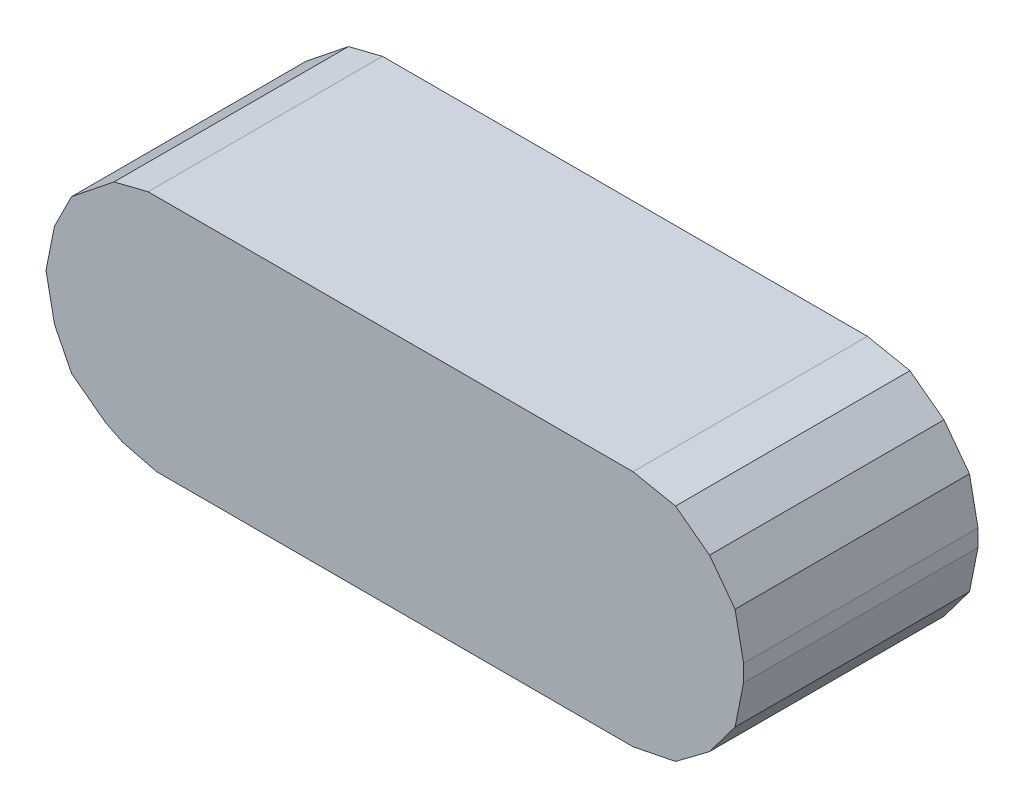
ISO-10303-21;
HEADER;
FILE_DESCRIPTION(('STEP AP214'),'2;1');
FILE_NAME('part.step','',(''),(''),'','','');
FILE_SCHEMA(('AUTOMOTIVE_DESIGN { 1 0 10303 214 1 1 1 1 }'));
ENDSEC;
DATA;
#1=APPLICATION_CONTEXT('core data for automotive mechanical design processes');
#2=APPLICATION_PROTOCOL_DEFINITION('international standard','automotive_design',2000,#1);
#3=PRODUCT_CONTEXT('',#1,'mechanical');
#4=PRODUCT('Part','Part','',(#3));
#5=PRODUCT_RELATED_PRODUCT_CATEGORY('part','',(#4));
#6=PRODUCT_DEFINITION_FORMATION('','',#4);
#7=PRODUCT_DEFINITION_CONTEXT('part definition',#1,'design');
#8=PRODUCT_DEFINITION('design','',#6,#7);
#9=PRODUCT_DEFINITION_SHAPE('','',#8);
#10=(LENGTH_UNIT() NAMED_UNIT(*) SI_UNIT(.MILLI.,.METRE.));
#11=(NAMED_UNIT(*) PLANE_ANGLE_UNIT() SI_UNIT($,.RADIAN.));
#12=(NAMED_UNIT(*) SI_UNIT($,.STERADIAN.) SOLID_ANGLE_UNIT());
#13=UNCERTAINTY_MEASURE_WITH_UNIT(LENGTH_MEASURE(1.E-05),#10,'distance_accuracy_value','');
#14=(GEOMETRIC_REPRESENTATION_CONTEXT(3) GLOBAL_UNCERTAINTY_ASSIGNED_CONTEXT((#13)) GLOBAL_UNIT_ASSIGNED_CONTEXT((#10,
#11,#12)) REPRESENTATION_CONTEXT('',''));
#15=CARTESIAN_POINT('',(0.,0.,0.));
#16=DIRECTION('',(0.,0.,1.));
#17=DIRECTION('',(1.,0.,0.));
#18=AXIS2_PLACEMENT_3D('',#15,#16,#17);
#19=CARTESIAN_POINT('',(-5.207,0.,0.));
#20=DIRECTION('',(0.980580675690959,0.196116135137992,0.));
#21=DIRECTION('',(-0.196116135137992,0.980580675690959,0.));
#22=AXIS2_PLACEMENT_3D('',#19,#20,#21);
#23=PLANE('',#22);
#24=DIRECTION('',(0.,0.,1.));
#25=VECTOR('',#24,1.);
#26=CARTESIAN_POINT('',(-5.08,-0.635,0.));
#27=LINE('',#26,#25);
#28=CARTESIAN_POINT('',(-5.08000000000006,-0.635000000000012,0.));
#29=VERTEX_POINT('',#28);
#30=CARTESIAN_POINT('',(-5.08000000000006,-0.635000000000012,3.5));
#31=VERTEX_POINT('',#30);
#32=EDGE_CURVE('E192',#29,#31,#27,.T.);
#33=ORIENTED_EDGE('',*,*,#32,.T.);
#34=DIRECTION('',(-0.196116135137992,0.980580675690959,0.));
#35=VECTOR('',#34,1.);
#36=CARTESIAN_POINT('',(-5.207,0.,3.5));
#37=LINE('',#36,#35);
#38=CARTESIAN_POINT('',(-5.20699999999997,0.,3.5));
#39=VERTEX_POINT('',#38);
#40=EDGE_CURVE('E20',#39,#31,#37,.F.);
#41=ORIENTED_EDGE('',*,*,#40,.F.);
#42=DIRECTION('',(0.,0.,1.));
#43=VECTOR('',#42,1.);
#44=CARTESIAN_POINT('',(-5.20699999999988,0.,0.));
#45=LINE('',#44,#43);
#46=CARTESIAN_POINT('',(-5.20699999999997,0.,0.));
#47=VERTEX_POINT('',#46);
#48=EDGE_CURVE('E206',#39,#47,#45,.F.);
#49=ORIENTED_EDGE('',*,*,#48,.T.);
#50=DIRECTION('',(-0.196116135137992,0.980580675690959,0.));
#51=VECTOR('',#50,1.);
#52=CARTESIAN_POINT('',(-5.207,0.,0.));
#53=LINE('',#52,#51);
#54=EDGE_CURVE('E164',#29,#47,#53,.T.);
#55=ORIENTED_EDGE('',*,*,#54,.F.);
#56=EDGE_LOOP('',(#33,#41,#49,#55));
#57=FACE_BOUND('',#56,.T.);
#58=ADVANCED_FACE('F17',(#57),#23,.F.);
#59=CARTESIAN_POINT('',(5.207,-0.127,0.));
#60=DIRECTION('',(-1.,0.,0.));
#61=DIRECTION('',(0.,0.,1.));
#62=AXIS2_PLACEMENT_3D('',#59,#60,#61);
#63=PLANE('',#62);
#64=DIRECTION('',(0.,0.,1.));
#65=VECTOR('',#64,1.);
#66=CARTESIAN_POINT('',(5.207,0.127,0.));
#67=LINE('',#66,#65);
#68=CARTESIAN_POINT('',(5.207,0.127000000000001,0.));
#69=VERTEX_POINT('',#68);
#70=CARTESIAN_POINT('',(5.207,0.127000000000001,3.5));
#71=VERTEX_POINT('',#70);
#72=EDGE_CURVE('E167',#69,#71,#67,.T.);
#73=ORIENTED_EDGE('',*,*,#72,.T.);
#74=DIRECTION('',(0.,1.,0.));
#75=VECTOR('',#74,1.);
#76=CARTESIAN_POINT('',(5.207,-0.127,3.5));
#77=LINE('',#76,#75);
#78=CARTESIAN_POINT('',(5.20699999999997,-0.126999999999994,3.5));
#79=VERTEX_POINT('',#78);
#80=EDGE_CURVE('E155',#79,#71,#77,.T.);
#81=ORIENTED_EDGE('',*,*,#80,.F.);
#82=DIRECTION('',(0.,0.,1.));
#83=VECTOR('',#82,1.);
#84=CARTESIAN_POINT('',(5.20699999999988,-0.126999999999975,0.));
#85=LINE('',#84,#83);
#86=CARTESIAN_POINT('',(5.20699999999997,-0.126999999999994,0.));
#87=VERTEX_POINT('',#86);
#88=EDGE_CURVE('E273',#79,#87,#85,.F.);
#89=ORIENTED_EDGE('',*,*,#88,.T.);
#90=DIRECTION('',(0.,1.,0.));
#91=VECTOR('',#90,1.);
#92=CARTESIAN_POINT('',(5.207,-0.127,0.));
#93=LINE('',#92,#91);
#94=EDGE_CURVE('E150',#69,#87,#93,.F.);
#95=ORIENTED_EDGE('',*,*,#94,.F.);
#96=EDGE_LOOP('',(#73,#81,#89,#95));
#97=FACE_BOUND('',#96,.T.);
#98=ADVANCED_FACE('F168',(#97),#63,.F.);
#99=CARTESIAN_POINT('',(5.207,0.127,0.));
#100=DIRECTION('',(-0.980580675690959,-0.196116135137992,0.));
#101=DIRECTION('',(0.196116135137992,-0.980580675690959,0.));
#102=AXIS2_PLACEMENT_3D('',#99,#100,#101);
#103=PLANE('',#102);
#104=DIRECTION('',(0.,0.,1.));
#105=VECTOR('',#104,1.);
#106=CARTESIAN_POINT('',(5.08,0.762,0.));
#107=LINE('',#106,#105);
#108=CARTESIAN_POINT('',(5.08000000000006,0.762000000000012,0.));
#109=VERTEX_POINT('',#108);
#110=CARTESIAN_POINT('',(5.08000000000006,0.762000000000012,3.5));
#111=VERTEX_POINT('',#110);
#112=EDGE_CURVE('E173',#109,#111,#107,.T.);
#113=ORIENTED_EDGE('',*,*,#112,.T.);
#114=DIRECTION('',(0.196116135137992,-0.980580675690959,0.));
#115=VECTOR('',#114,1.);
#116=CARTESIAN_POINT('',(5.207,0.127,3.5));
#117=LINE('',#116,#115);
#118=EDGE_CURVE('E159',#71,#111,#117,.F.);
#119=ORIENTED_EDGE('',*,*,#118,.F.);
#120=ORIENTED_EDGE('',*,*,#72,.F.);
#121=DIRECTION('',(0.196116135137992,-0.980580675690959,0.));
#122=VECTOR('',#121,1.);
#123=CARTESIAN_POINT('',(5.207,0.127,0.));
#124=LINE('',#123,#122);
#125=EDGE_CURVE('E175',#109,#69,#124,.T.);
#126=ORIENTED_EDGE('',*,*,#125,.F.);
#127=EDGE_LOOP('',(#113,#119,#120,#126));
#128=FACE_BOUND('',#127,.T.);
#129=ADVANCED_FACE('F171',(#128),#103,.F.);
#130=CARTESIAN_POINT('',(-5.08,0.635,0.));
#131=DIRECTION('',(0.980580675690959,-0.196116135137992,0.));
#132=DIRECTION('',(0.196116135137992,0.980580675690959,0.));
#133=AXIS2_PLACEMENT_3D('',#130,#131,#132);
#134=PLANE('',#133);
#135=ORIENTED_EDGE('',*,*,#48,.F.);
#136=DIRECTION('',(0.196116135137992,0.980580675690959,0.));
#137=VECTOR('',#136,1.);
#138=CARTESIAN_POINT('',(-5.08,0.635,3.5));
#139=LINE('',#138,#137);
#140=CARTESIAN_POINT('',(-5.08,0.634999999999998,3.5));
#141=VERTEX_POINT('',#140);
#142=EDGE_CURVE('E177',#141,#39,#139,.F.);
#143=ORIENTED_EDGE('',*,*,#142,.F.);
#144=DIRECTION('',(0.,0.,1.));
#145=VECTOR('',#144,1.);
#146=CARTESIAN_POINT('',(-5.08,0.635,0.));
#147=LINE('',#146,#145);
#148=CARTESIAN_POINT('',(-5.08,0.634999999999999,0.));
#149=VERTEX_POINT('',#148);
#150=EDGE_CURVE('E212',#141,#149,#147,.F.);
#151=ORIENTED_EDGE('',*,*,#150,.T.);
#152=DIRECTION('',(0.196116135137992,0.980580675690959,0.));
#153=VECTOR('',#152,1.);
#154=CARTESIAN_POINT('',(-5.08,0.635,0.));
#155=LINE('',#154,#153);
#156=EDGE_CURVE('E194',#47,#149,#155,.T.);
#157=ORIENTED_EDGE('',*,*,#156,.F.);
#158=EDGE_LOOP('',(#135,#143,#151,#157));
#159=FACE_BOUND('',#158,.T.);
#160=ADVANCED_FACE('F210',(#159),#134,.F.);
#161=CARTESIAN_POINT('',(-5.08,-0.635,0.));
#162=DIRECTION('',(0.894427190999916,0.447213595499958,0.));
#163=DIRECTION('',(-0.447213595499958,0.894427190999916,0.));
#164=AXIS2_PLACEMENT_3D('',#161,#162,#163);
#165=PLANE('',#164);
#166=DIRECTION('',(0.,0.,1.));
#167=VECTOR('',#166,1.);
#168=CARTESIAN_POINT('',(-4.826,-1.143,0.));
#169=LINE('',#168,#167);
#170=CARTESIAN_POINT('',(-4.826,-1.143,0.));
#171=VERTEX_POINT('',#170);
#172=CARTESIAN_POINT('',(-4.826,-1.143,3.5));
#173=VERTEX_POINT('',#172);
#174=EDGE_CURVE('E198',#171,#173,#169,.T.);
#175=ORIENTED_EDGE('',*,*,#174,.T.);
#176=DIRECTION('',(-0.447213595499958,0.894427190999916,0.));
#177=VECTOR('',#176,1.);
#178=CARTESIAN_POINT('',(-5.08,-0.635,3.5));
#179=LINE('',#178,#177);
#180=EDGE_CURVE('E186',#31,#173,#179,.F.);
#181=ORIENTED_EDGE('',*,*,#180,.F.);
#182=ORIENTED_EDGE('',*,*,#32,.F.);
#183=DIRECTION('',(-0.447213595499958,0.894427190999916,0.));
#184=VECTOR('',#183,1.);
#185=CARTESIAN_POINT('',(-5.08,-0.635,0.));
#186=LINE('',#185,#184);
#187=EDGE_CURVE('E200',#171,#29,#186,.T.);
#188=ORIENTED_EDGE('',*,*,#187,.F.);
#189=EDGE_LOOP('',(#175,#181,#182,#188));
#190=FACE_BOUND('',#189,.T.);
#191=ADVANCED_FACE('F196',(#190),#165,.F.);
#192=CARTESIAN_POINT('',(5.08,-0.762,0.));
#193=DIRECTION('',(-0.980580675690959,0.196116135137992,0.));
#194=DIRECTION('',(-0.196116135137992,-0.980580675690959,0.));
#195=AXIS2_PLACEMENT_3D('',#192,#193,#194);
#196=PLANE('',#195);
#197=ORIENTED_EDGE('',*,*,#88,.F.);
#198=DIRECTION('',(-0.196116135137992,-0.980580675690959,0.));
#199=VECTOR('',#198,1.);
#200=CARTESIAN_POINT('',(5.08,-0.762,3.5));
#201=LINE('',#200,#199);
#202=CARTESIAN_POINT('',(5.08,-0.762,3.5));
#203=VERTEX_POINT('',#202);
#204=EDGE_CURVE('E162',#203,#79,#201,.F.);
#205=ORIENTED_EDGE('',*,*,#204,.F.);
#206=DIRECTION('',(0.,0.,1.));
#207=VECTOR('',#206,1.);
#208=CARTESIAN_POINT('',(5.08,-0.762,0.));
#209=LINE('',#208,#207);
#210=CARTESIAN_POINT('',(5.08,-0.762,0.));
#211=VERTEX_POINT('',#210);
#212=EDGE_CURVE('E252',#203,#211,#209,.F.);
#213=ORIENTED_EDGE('',*,*,#212,.T.);
#214=DIRECTION('',(-0.196116135137992,-0.980580675690959,0.));
#215=VECTOR('',#214,1.);
#216=CARTESIAN_POINT('',(5.08,-0.762,0.));
#217=LINE('',#216,#215);
#218=EDGE_CURVE('E271',#87,#211,#217,.T.);
#219=ORIENTED_EDGE('',*,*,#218,.F.);
#220=EDGE_LOOP('',(#197,#205,#213,#219));
#221=FACE_BOUND('',#220,.T.);
#222=ADVANCED_FACE('F276',(#221),#196,.F.);
#223=CARTESIAN_POINT('',(5.08,0.762,0.));
#224=DIRECTION('',(-0.8,-0.6,0.));
#225=DIRECTION('',(0.6,-0.8,0.));
#226=AXIS2_PLACEMENT_3D('',#223,#224,#225);
#227=PLANE('',#226);
#228=DIRECTION('',(0.,0.,1.));
#229=VECTOR('',#228,1.);
#230=CARTESIAN_POINT('',(4.699,1.27,0.));
#231=LINE('',#230,#229);
#232=CARTESIAN_POINT('',(4.699,1.27,0.));
#233=VERTEX_POINT('',#232);
#234=CARTESIAN_POINT('',(4.699,1.27,3.5));
#235=VERTEX_POINT('',#234);
#236=EDGE_CURVE('E247',#233,#235,#231,.T.);
#237=ORIENTED_EDGE('',*,*,#236,.T.);
#238=DIRECTION('',(0.6,-0.8,0.));
#239=VECTOR('',#238,1.);
#240=CARTESIAN_POINT('',(5.08,0.762,3.5));
#241=LINE('',#240,#239);
#242=EDGE_CURVE('E268',#111,#235,#241,.F.);
#243=ORIENTED_EDGE('',*,*,#242,.F.);
#244=ORIENTED_EDGE('',*,*,#112,.F.);
#245=DIRECTION('',(0.6,-0.8,0.));
#246=VECTOR('',#245,1.);
#247=CARTESIAN_POINT('',(5.08,0.762,0.));
#248=LINE('',#247,#246);
#249=EDGE_CURVE('E265',#233,#109,#248,.T.);
#250=ORIENTED_EDGE('',*,*,#249,.F.);
#251=EDGE_LOOP('',(#237,#243,#244,#250));
#252=FACE_BOUND('',#251,.T.);
#253=ADVANCED_FACE('F283',(#252),#227,.F.);
#254=CARTESIAN_POINT('',(-4.826,1.143,0.));
#255=DIRECTION('',(0.894427190999916,-0.447213595499958,0.));
#256=DIRECTION('',(0.447213595499958,0.894427190999916,0.));
#257=AXIS2_PLACEMENT_3D('',#254,#255,#256);
#258=PLANE('',#257);
#259=ORIENTED_EDGE('',*,*,#150,.F.);
#260=DIRECTION('',(0.447213595499958,0.894427190999916,0.));
#261=VECTOR('',#260,1.);
#262=CARTESIAN_POINT('',(-4.826,1.143,3.5));
#263=LINE('',#262,#261);
#264=CARTESIAN_POINT('',(-4.82600000000004,1.14300000000005,3.5));
#265=VERTEX_POINT('',#264);
#266=EDGE_CURVE('E226',#265,#141,#263,.F.);
#267=ORIENTED_EDGE('',*,*,#266,.F.);
#268=DIRECTION('',(0.,0.,1.));
#269=VECTOR('',#268,1.);
#270=CARTESIAN_POINT('',(-4.82600000000016,1.1430000000002,0.));
#271=LINE('',#270,#269);
#272=CARTESIAN_POINT('',(-4.82600000000004,1.14300000000005,0.));
#273=VERTEX_POINT('',#272);
#274=EDGE_CURVE('E224',#265,#273,#271,.F.);
#275=ORIENTED_EDGE('',*,*,#274,.T.);
#276=DIRECTION('',(0.447213595499958,0.894427190999916,0.));
#277=VECTOR('',#276,1.);
#278=CARTESIAN_POINT('',(-4.826,1.143,0.));
#279=LINE('',#278,#277);
#280=EDGE_CURVE('E215',#149,#273,#279,.T.);
#281=ORIENTED_EDGE('',*,*,#280,.F.);
#282=EDGE_LOOP('',(#259,#267,#275,#281));
#283=FACE_BOUND('',#282,.T.);
#284=ADVANCED_FACE('F225',(#283),#258,.F.);
#285=CARTESIAN_POINT('',(-4.826,-1.143,0.));
#286=DIRECTION('',(0.6,0.8,0.));
#287=DIRECTION('',(-0.8,0.6,0.));
#288=AXIS2_PLACEMENT_3D('',#285,#286,#287);
#289=PLANE('',#288);
#290=DIRECTION('',(0.,0.,1.));
#291=VECTOR('',#290,1.);
#292=CARTESIAN_POINT('',(-4.318,-1.524,0.));
#293=LINE('',#292,#291);
#294=CARTESIAN_POINT('',(-4.318,-1.524,0.));
#295=VERTEX_POINT('',#294);
#296=CARTESIAN_POINT('',(-4.318,-1.524,3.5));
#297=VERTEX_POINT('',#296);
#298=EDGE_CURVE('E234',#295,#297,#293,.T.);
#299=ORIENTED_EDGE('',*,*,#298,.T.);
#300=DIRECTION('',(-0.8,0.6,0.));
#301=VECTOR('',#300,1.);
#302=CARTESIAN_POINT('',(-4.826,-1.143,3.5));
#303=LINE('',#302,#301);
#304=EDGE_CURVE('E260',#173,#297,#303,.F.);
#305=ORIENTED_EDGE('',*,*,#304,.F.);
#306=ORIENTED_EDGE('',*,*,#174,.F.);
#307=DIRECTION('',(-0.8,0.6,0.));
#308=VECTOR('',#307,1.);
#309=CARTESIAN_POINT('',(-4.826,-1.143,0.));
#310=LINE('',#309,#308);
#311=EDGE_CURVE('E257',#295,#171,#310,.T.);
#312=ORIENTED_EDGE('',*,*,#311,.F.);
#313=EDGE_LOOP('',(#299,#305,#306,#312));
#314=FACE_BOUND('',#313,.T.);
#315=ADVANCED_FACE('F369',(#314),#289,.F.);
#316=CARTESIAN_POINT('',(4.699,-1.27,0.));
#317=DIRECTION('',(-0.8,0.6,0.));
#318=DIRECTION('',(-0.6,-0.8,0.));
#319=AXIS2_PLACEMENT_3D('',#316,#317,#318);
#320=PLANE('',#319);
#321=ORIENTED_EDGE('',*,*,#212,.F.);
#322=DIRECTION('',(-0.6,-0.8,0.));
#323=VECTOR('',#322,1.);
#324=CARTESIAN_POINT('',(4.699,-1.27,3.5));
#325=LINE('',#324,#323);
#326=CARTESIAN_POINT('',(4.699,-1.27,3.5));
#327=VERTEX_POINT('',#326);
#328=EDGE_CURVE('E255',#327,#203,#325,.F.);
#329=ORIENTED_EDGE('',*,*,#328,.F.);
#330=DIRECTION('',(0.,0.,1.));
#331=VECTOR('',#330,1.);
#332=CARTESIAN_POINT('',(4.699,-1.27,0.));
#333=LINE('',#332,#331);
#334=CARTESIAN_POINT('',(4.699,-1.27,0.));
#335=VERTEX_POINT('',#334);
#336=EDGE_CURVE('E324',#327,#335,#333,.F.);
#337=ORIENTED_EDGE('',*,*,#336,.T.);
#338=DIRECTION('',(-0.6,-0.8,0.));
#339=VECTOR('',#338,1.);
#340=CARTESIAN_POINT('',(4.699,-1.27,0.));
#341=LINE('',#340,#339);
#342=EDGE_CURVE('E250',#211,#335,#341,.T.);
#343=ORIENTED_EDGE('',*,*,#342,.F.);
#344=EDGE_LOOP('',(#321,#329,#337,#343));
#345=FACE_BOUND('',#344,.T.);
#346=ADVANCED_FACE('F367',(#345),#320,.F.);
#347=CARTESIAN_POINT('',(4.699,1.27,0.));
#348=DIRECTION('',(-0.6,-0.8,0.));
#349=DIRECTION('',(0.8,-0.6,0.));
#350=AXIS2_PLACEMENT_3D('',#347,#348,#349);
#351=PLANE('',#350);
#352=DIRECTION('',(0.,0.,1.));
#353=VECTOR('',#352,1.);
#354=CARTESIAN_POINT('',(4.191,1.651,0.));
#355=LINE('',#354,#353);
#356=CARTESIAN_POINT('',(4.191,1.651,0.));
#357=VERTEX_POINT('',#356);
#358=CARTESIAN_POINT('',(4.191,1.651,3.5));
#359=VERTEX_POINT('',#358);
#360=EDGE_CURVE('E293',#357,#359,#355,.T.);
#361=ORIENTED_EDGE('',*,*,#360,.T.);
#362=DIRECTION('',(0.8,-0.6,0.));
#363=VECTOR('',#362,1.);
#364=CARTESIAN_POINT('',(4.699,1.27,3.5));
#365=LINE('',#364,#363);
#366=EDGE_CURVE('E245',#235,#359,#365,.F.);
#367=ORIENTED_EDGE('',*,*,#366,.F.);
#368=ORIENTED_EDGE('',*,*,#236,.F.);
#369=DIRECTION('',(0.8,-0.6,0.));
#370=VECTOR('',#369,1.);
#371=CARTESIAN_POINT('',(4.699,1.27,0.));
#372=LINE('',#371,#370);
#373=EDGE_CURVE('E242',#357,#233,#372,.T.);
#374=ORIENTED_EDGE('',*,*,#373,.F.);
#375=EDGE_LOOP('',(#361,#367,#368,#374));
#376=FACE_BOUND('',#375,.T.);
#377=ADVANCED_FACE('F294',(#376),#351,.F.);
#378=CARTESIAN_POINT('',(-4.191,1.651,0.));
#379=DIRECTION('',(0.62469504755418,-0.780868809443225,0.));
#380=DIRECTION('',(0.780868809443225,0.62469504755418,0.));
#381=AXIS2_PLACEMENT_3D('',#378,#379,#380);
#382=PLANE('',#381);
#383=ORIENTED_EDGE('',*,*,#274,.F.);
#384=DIRECTION('',(0.780868809443225,0.62469504755418,0.));
#385=VECTOR('',#384,1.);
#386=CARTESIAN_POINT('',(-4.191,1.651,3.5));
#387=LINE('',#386,#385);
#388=CARTESIAN_POINT('',(-4.19100000000001,1.65100000000003,3.5));
#389=VERTEX_POINT('',#388);
#390=EDGE_CURVE('E228',#389,#265,#387,.F.);
#391=ORIENTED_EDGE('',*,*,#390,.F.);
#392=DIRECTION('',(0.,0.,1.));
#393=VECTOR('',#392,1.);
#394=CARTESIAN_POINT('',(-4.19100000000003,1.65100000000012,0.));
#395=LINE('',#394,#393);
#396=CARTESIAN_POINT('',(-4.19100000000001,1.65100000000003,0.));
#397=VERTEX_POINT('',#396);
#398=EDGE_CURVE('E232',#389,#397,#395,.F.);
#399=ORIENTED_EDGE('',*,*,#398,.T.);
#400=DIRECTION('',(0.780868809443225,0.62469504755418,0.));
#401=VECTOR('',#400,1.);
#402=CARTESIAN_POINT('',(-4.191,1.651,0.));
#403=LINE('',#402,#401);
#404=EDGE_CURVE('E218',#273,#397,#403,.T.);
#405=ORIENTED_EDGE('',*,*,#404,.F.);
#406=EDGE_LOOP('',(#383,#391,#399,#405));
#407=FACE_BOUND('',#406,.T.);
#408=ADVANCED_FACE('F230',(#407),#382,.F.);
#409=CARTESIAN_POINT('',(-4.318,-1.524,0.));
#410=DIRECTION('',(0.447213595499958,0.894427190999916,0.));
#411=DIRECTION('',(-0.894427190999916,0.447213595499958,0.));
#412=AXIS2_PLACEMENT_3D('',#409,#410,#411);
#413=PLANE('',#412);
#414=DIRECTION('',(0.,0.,1.));
#415=VECTOR('',#414,1.);
#416=CARTESIAN_POINT('',(-4.064,-1.651,0.));
#417=LINE('',#416,#415);
#418=CARTESIAN_POINT('',(-4.064,-1.651,0.));
#419=VERTEX_POINT('',#418);
#420=CARTESIAN_POINT('',(-4.064,-1.651,3.5));
#421=VERTEX_POINT('',#420);
#422=EDGE_CURVE('E316',#419,#421,#417,.T.);
#423=ORIENTED_EDGE('',*,*,#422,.T.);
#424=DIRECTION('',(-0.894427190999916,0.447213595499958,0.));
#425=VECTOR('',#424,1.);
#426=CARTESIAN_POINT('',(-4.318,-1.524,3.5));
#427=LINE('',#426,#425);
#428=EDGE_CURVE('E237',#297,#421,#427,.F.);
#429=ORIENTED_EDGE('',*,*,#428,.F.);
#430=ORIENTED_EDGE('',*,*,#298,.F.);
#431=DIRECTION('',(-0.894427190999916,0.447213595499958,0.));
#432=VECTOR('',#431,1.);
#433=CARTESIAN_POINT('',(-4.318,-1.524,0.));
#434=LINE('',#433,#432);
#435=EDGE_CURVE('E326',#419,#295,#434,.T.);
#436=ORIENTED_EDGE('',*,*,#435,.F.);
#437=EDGE_LOOP('',(#423,#429,#430,#436));
#438=FACE_BOUND('',#437,.T.);
#439=ADVANCED_FACE('F334',(#438),#413,.F.);
#440=CARTESIAN_POINT('',(4.191,-1.651,0.));
#441=DIRECTION('',(-0.6,0.8,0.));
#442=DIRECTION('',(-0.8,-0.6,0.));
#443=AXIS2_PLACEMENT_3D('',#440,#441,#442);
#444=PLANE('',#443);
#445=ORIENTED_EDGE('',*,*,#336,.F.);
#446=DIRECTION('',(-0.8,-0.6,0.));
#447=VECTOR('',#446,1.);
#448=CARTESIAN_POINT('',(4.699,-1.27,3.5));
#449=LINE('',#448,#447);
#450=CARTESIAN_POINT('',(4.19100000000001,-1.65100000000003,3.5));
#451=VERTEX_POINT('',#450);
#452=EDGE_CURVE('E302',#327,#451,#449,.T.);
#453=ORIENTED_EDGE('',*,*,#452,.T.);
#454=DIRECTION('',(0.,0.,1.));
#455=VECTOR('',#454,1.);
#456=CARTESIAN_POINT('',(4.19100000000003,-1.65100000000012,0.));
#457=LINE('',#456,#455);
#458=CARTESIAN_POINT('',(4.19100000000001,-1.65100000000003,0.));
#459=VERTEX_POINT('',#458);
#460=EDGE_CURVE('E354',#451,#459,#457,.F.);
#461=ORIENTED_EDGE('',*,*,#460,.T.);
#462=DIRECTION('',(-0.8,-0.6,0.));
#463=VECTOR('',#462,1.);
#464=CARTESIAN_POINT('',(4.191,-1.651,0.));
#465=LINE('',#464,#463);
#466=EDGE_CURVE('E297',#335,#459,#465,.T.);
#467=ORIENTED_EDGE('',*,*,#466,.F.);
#468=EDGE_LOOP('',(#445,#453,#461,#467));
#469=FACE_BOUND('',#468,.T.);
#470=ADVANCED_FACE('F365',(#469),#444,.F.);
#471=CARTESIAN_POINT('',(4.191,1.651,0.));
#472=DIRECTION('',(-0.196116135137992,-0.980580675690959,0.));
#473=DIRECTION('',(0.980580675690959,-0.196116135137992,0.));
#474=AXIS2_PLACEMENT_3D('',#471,#472,#473);
#475=PLANE('',#474);
#476=DIRECTION('',(0.,0.,-1.));
#477=VECTOR('',#476,1.);
#478=CARTESIAN_POINT('',(3.556,1.778,0.));
#479=LINE('',#478,#477);
#480=CARTESIAN_POINT('',(3.55599999999999,1.77799999999994,0.));
#481=VERTEX_POINT('',#480);
#482=CARTESIAN_POINT('',(3.55599999999999,1.77799999999994,3.5));
#483=VERTEX_POINT('',#482);
#484=EDGE_CURVE('E301',#481,#483,#479,.F.);
#485=ORIENTED_EDGE('',*,*,#484,.T.);
#486=DIRECTION('',(0.98058067569092,-0.196116135138184,0.));
#487=VECTOR('',#486,1.);
#488=CARTESIAN_POINT('',(3.556,1.778,3.5));
#489=LINE('',#488,#487);
#490=EDGE_CURVE('E289',#483,#359,#489,.T.);
#491=ORIENTED_EDGE('',*,*,#490,.T.);
#492=ORIENTED_EDGE('',*,*,#360,.F.);
#493=DIRECTION('',(0.980580675690959,-0.196116135137992,0.));
#494=VECTOR('',#493,1.);
#495=CARTESIAN_POINT('',(4.191,1.651,0.));
#496=LINE('',#495,#494);
#497=EDGE_CURVE('E296',#481,#357,#496,.T.);
#498=ORIENTED_EDGE('',*,*,#497,.F.);
#499=EDGE_LOOP('',(#485,#491,#492,#498));
#500=FACE_BOUND('',#499,.T.);
#501=ADVANCED_FACE('F299',(#500),#475,.F.);
#502=CARTESIAN_POINT('',(-3.683,1.778,0.));
#503=DIRECTION('',(0.242535625036098,-0.970142500145391,0.));
#504=DIRECTION('',(0.970142500145391,0.242535625036098,0.));
#505=AXIS2_PLACEMENT_3D('',#502,#503,#504);
#506=PLANE('',#505);
#507=ORIENTED_EDGE('',*,*,#398,.F.);
#508=DIRECTION('',(0.970142500145332,0.242535625036333,0.));
#509=VECTOR('',#508,1.);
#510=CARTESIAN_POINT('',(-4.191,1.651,3.5));
#511=LINE('',#510,#509);
#512=CARTESIAN_POINT('',(-3.683,1.778,3.5));
#513=VERTEX_POINT('',#512);
#514=EDGE_CURVE('E303',#389,#513,#511,.T.);
#515=ORIENTED_EDGE('',*,*,#514,.T.);
#516=DIRECTION('',(0.,0.,-1.));
#517=VECTOR('',#516,1.);
#518=CARTESIAN_POINT('',(-3.683,1.778,0.));
#519=LINE('',#518,#517);
#520=CARTESIAN_POINT('',(-3.683,1.778,0.));
#521=VERTEX_POINT('',#520);
#522=EDGE_CURVE('E342',#513,#521,#519,.T.);
#523=ORIENTED_EDGE('',*,*,#522,.T.);
#524=DIRECTION('',(0.970142500145391,0.242535625036098,0.));
#525=VECTOR('',#524,1.);
#526=CARTESIAN_POINT('',(-3.683,1.778,0.));
#527=LINE('',#526,#525);
#528=EDGE_CURVE('E319',#397,#521,#527,.T.);
#529=ORIENTED_EDGE('',*,*,#528,.F.);
#530=EDGE_LOOP('',(#507,#515,#523,#529));
#531=FACE_BOUND('',#530,.T.);
#532=ADVANCED_FACE('F397',(#531),#506,.F.);
#533=CARTESIAN_POINT('',(-4.064,-1.651,0.));
#534=DIRECTION('',(0.242535625036098,0.970142500145391,0.));
#535=DIRECTION('',(-0.970142500145391,0.242535625036098,0.));
#536=AXIS2_PLACEMENT_3D('',#533,#534,#535);
#537=PLANE('',#536);
#538=DIRECTION('',(0.,0.,1.));
#539=VECTOR('',#538,1.);
#540=CARTESIAN_POINT('',(-3.556,-1.778,0.));
#541=LINE('',#540,#539);
#542=CARTESIAN_POINT('',(-3.55599999999998,-1.77799999999994,0.));
#543=VERTEX_POINT('',#542);
#544=CARTESIAN_POINT('',(-3.55599999999998,-1.77799999999994,3.5));
#545=VERTEX_POINT('',#544);
#546=EDGE_CURVE('E338',#543,#545,#541,.T.);
#547=ORIENTED_EDGE('',*,*,#546,.T.);
#548=DIRECTION('',(-0.970142500145332,0.242535625036333,0.));
#549=VECTOR('',#548,1.);
#550=CARTESIAN_POINT('',(-3.556,-1.778,3.5));
#551=LINE('',#550,#549);
#552=EDGE_CURVE('E307',#545,#421,#551,.T.);
#553=ORIENTED_EDGE('',*,*,#552,.T.);
#554=ORIENTED_EDGE('',*,*,#422,.F.);
#555=DIRECTION('',(-0.970142500145391,0.242535625036098,0.));
#556=VECTOR('',#555,1.);
#557=CARTESIAN_POINT('',(-4.064,-1.651,0.));
#558=LINE('',#557,#556);
#559=EDGE_CURVE('E313',#543,#419,#558,.T.);
#560=ORIENTED_EDGE('',*,*,#559,.F.);
#561=EDGE_LOOP('',(#547,#553,#554,#560));
#562=FACE_BOUND('',#561,.T.);
#563=ADVANCED_FACE('F336',(#562),#537,.F.);
#564=CARTESIAN_POINT('',(-3.556,-1.778,3.5));
#565=DIRECTION('',(0.,0.,-1.));
#566=DIRECTION('',(-1.,0.,0.));
#567=AXIS2_PLACEMENT_3D('',#564,#565,#566);
#568=PLANE('',#567);
#569=DIRECTION('',(-0.980580675690959,-0.196116135137992,0.));
#570=VECTOR('',#569,1.);
#571=CARTESIAN_POINT('',(3.556,-1.778,3.5));
#572=LINE('',#571,#570);
#573=CARTESIAN_POINT('',(3.556,-1.778,3.5));
#574=VERTEX_POINT('',#573);
#575=EDGE_CURVE('E305',#574,#451,#572,.F.);
#576=ORIENTED_EDGE('',*,*,#575,.T.);
#577=ORIENTED_EDGE('',*,*,#452,.F.);
#578=ORIENTED_EDGE('',*,*,#328,.T.);
#579=ORIENTED_EDGE('',*,*,#204,.T.);
#580=ORIENTED_EDGE('',*,*,#80,.T.);
#581=ORIENTED_EDGE('',*,*,#118,.T.);
#582=ORIENTED_EDGE('',*,*,#242,.T.);
#583=ORIENTED_EDGE('',*,*,#366,.T.);
#584=ORIENTED_EDGE('',*,*,#490,.F.);
#585=DIRECTION('',(1.,0.,0.));
#586=VECTOR('',#585,1.);
#587=CARTESIAN_POINT('',(3.556,1.778,3.5));
#588=LINE('',#587,#586);
#589=EDGE_CURVE('E347',#483,#513,#588,.F.);
#590=ORIENTED_EDGE('',*,*,#589,.T.);
#591=ORIENTED_EDGE('',*,*,#514,.F.);
#592=ORIENTED_EDGE('',*,*,#390,.T.);
#593=ORIENTED_EDGE('',*,*,#266,.T.);
#594=ORIENTED_EDGE('',*,*,#142,.T.);
#595=ORIENTED_EDGE('',*,*,#40,.T.);
#596=ORIENTED_EDGE('',*,*,#180,.T.);
#597=ORIENTED_EDGE('',*,*,#304,.T.);
#598=ORIENTED_EDGE('',*,*,#428,.T.);
#599=ORIENTED_EDGE('',*,*,#552,.F.);
#600=DIRECTION('',(1.,0.,0.));
#601=VECTOR('',#600,1.);
#602=CARTESIAN_POINT('',(-3.556,-1.778,3.5));
#603=LINE('',#602,#601);
#604=EDGE_CURVE('E341',#545,#574,#603,.T.);
#605=ORIENTED_EDGE('',*,*,#604,.T.);
#606=EDGE_LOOP('',(#576,#577,#578,#579,#580,#581,#582,#583,#584,#590,#591,#592,#593,#594,#595,
#596,#597,#598,#599,#605));
#607=FACE_BOUND('',#606,.T.);
#608=ADVANCED_FACE('F157',(#607),#568,.F.);
#609=CARTESIAN_POINT('',(3.556,-1.778,0.));
#610=DIRECTION('',(-0.196116135137992,0.980580675690959,0.));
#611=DIRECTION('',(-0.980580675690959,-0.196116135137992,0.));
#612=AXIS2_PLACEMENT_3D('',#609,#610,#611);
#613=PLANE('',#612);
#614=ORIENTED_EDGE('',*,*,#460,.F.);
#615=ORIENTED_EDGE('',*,*,#575,.F.);
#616=DIRECTION('',(0.,0.,1.));
#617=VECTOR('',#616,1.);
#618=CARTESIAN_POINT('',(3.556,-1.778,0.));
#619=LINE('',#618,#617);
#620=CARTESIAN_POINT('',(3.556,-1.778,0.));
#621=VERTEX_POINT('',#620);
#622=EDGE_CURVE('E344',#574,#621,#619,.F.);
#623=ORIENTED_EDGE('',*,*,#622,.T.);
#624=DIRECTION('',(-0.980580675690959,-0.196116135137992,0.));
#625=VECTOR('',#624,1.);
#626=CARTESIAN_POINT('',(3.556,-1.778,0.));
#627=LINE('',#626,#625);
#628=EDGE_CURVE('E34',#459,#621,#627,.T.);
#629=ORIENTED_EDGE('',*,*,#628,.F.);
#630=EDGE_LOOP('',(#614,#615,#623,#629));
#631=FACE_BOUND('',#630,.T.);
#632=ADVANCED_FACE('F361',(#631),#613,.F.);
#633=CARTESIAN_POINT('',(3.556,1.778,0.));
#634=DIRECTION('',(0.,-1.,0.));
#635=DIRECTION('',(0.,0.,-1.));
#636=AXIS2_PLACEMENT_3D('',#633,#634,#635);
#637=PLANE('',#636);
#638=ORIENTED_EDGE('',*,*,#522,.F.);
#639=ORIENTED_EDGE('',*,*,#589,.F.);
#640=ORIENTED_EDGE('',*,*,#484,.F.);
#641=DIRECTION('',(-1.,0.,0.));
#642=VECTOR('',#641,1.);
#643=CARTESIAN_POINT('',(-3.556,1.778,0.));
#644=LINE('',#643,#642);
#645=EDGE_CURVE('E26',#521,#481,#644,.F.);
#646=ORIENTED_EDGE('',*,*,#645,.F.);
#647=EDGE_LOOP('',(#638,#639,#640,#646));
#648=FACE_BOUND('',#647,.T.);
#649=ADVANCED_FACE('F385',(#648),#637,.F.);
#650=CARTESIAN_POINT('',(-3.556,-1.778,0.));
#651=DIRECTION('',(0.,1.,0.));
#652=DIRECTION('',(0.,0.,1.));
#653=AXIS2_PLACEMENT_3D('',#650,#651,#652);
#654=PLANE('',#653);
#655=ORIENTED_EDGE('',*,*,#622,.F.);
#656=ORIENTED_EDGE('',*,*,#604,.F.);
#657=ORIENTED_EDGE('',*,*,#546,.F.);
#658=DIRECTION('',(-1.,0.,0.));
#659=VECTOR('',#658,1.);
#660=CARTESIAN_POINT('',(-3.556,-1.778,0.));
#661=LINE('',#660,#659);
#662=EDGE_CURVE('E11',#621,#543,#661,.T.);
#663=ORIENTED_EDGE('',*,*,#662,.F.);
#664=EDGE_LOOP('',(#655,#656,#657,#663));
#665=FACE_BOUND('',#664,.T.);
#666=ADVANCED_FACE('F380',(#665),#654,.F.);
#667=CARTESIAN_POINT('',(-3.556,-1.778,0.));
#668=DIRECTION('',(0.,0.,-1.));
#669=DIRECTION('',(-1.,0.,0.));
#670=AXIS2_PLACEMENT_3D('',#667,#668,#669);
#671=PLANE('',#670);
#672=ORIENTED_EDGE('',*,*,#628,.T.);
#673=ORIENTED_EDGE('',*,*,#662,.T.);
#674=ORIENTED_EDGE('',*,*,#559,.T.);
#675=ORIENTED_EDGE('',*,*,#435,.T.);
#676=ORIENTED_EDGE('',*,*,#311,.T.);
#677=ORIENTED_EDGE('',*,*,#187,.T.);
#678=ORIENTED_EDGE('',*,*,#54,.T.);
#679=ORIENTED_EDGE('',*,*,#156,.T.);
#680=ORIENTED_EDGE('',*,*,#280,.T.);
#681=ORIENTED_EDGE('',*,*,#404,.T.);
#682=ORIENTED_EDGE('',*,*,#528,.T.);
#683=ORIENTED_EDGE('',*,*,#645,.T.);
#684=ORIENTED_EDGE('',*,*,#497,.T.);
#685=ORIENTED_EDGE('',*,*,#373,.T.);
#686=ORIENTED_EDGE('',*,*,#249,.T.);
#687=ORIENTED_EDGE('',*,*,#125,.T.);
#688=ORIENTED_EDGE('',*,*,#94,.T.);
#689=ORIENTED_EDGE('',*,*,#218,.T.);
#690=ORIENTED_EDGE('',*,*,#342,.T.);
#691=ORIENTED_EDGE('',*,*,#466,.T.);
#692=EDGE_LOOP('',(#672,#673,#674,#675,#676,#677,#678,#679,#680,#681,#682,#683,#684,#685,#686,
#687,#688,#689,#690,#691));
#693=FACE_BOUND('',#692,.T.);
#694=ADVANCED_FACE('F214',(#693),#671,.T.);
#695=CLOSED_SHELL('',(#58,#98,#129,#160,#191,#222,#253,#284,#315,#346,#377,#408,#439,#470,#501,
#532,#563,#608,#632,#649,#666,#694));
#696=MANIFOLD_SOLID_BREP('B1',#695);
#697=ADVANCED_BREP_SHAPE_REPRESENTATION('',(#18,#696),#14);
#698=SHAPE_DEFINITION_REPRESENTATION(#9,#697);
ENDSEC;
END-ISO-10303-21;
